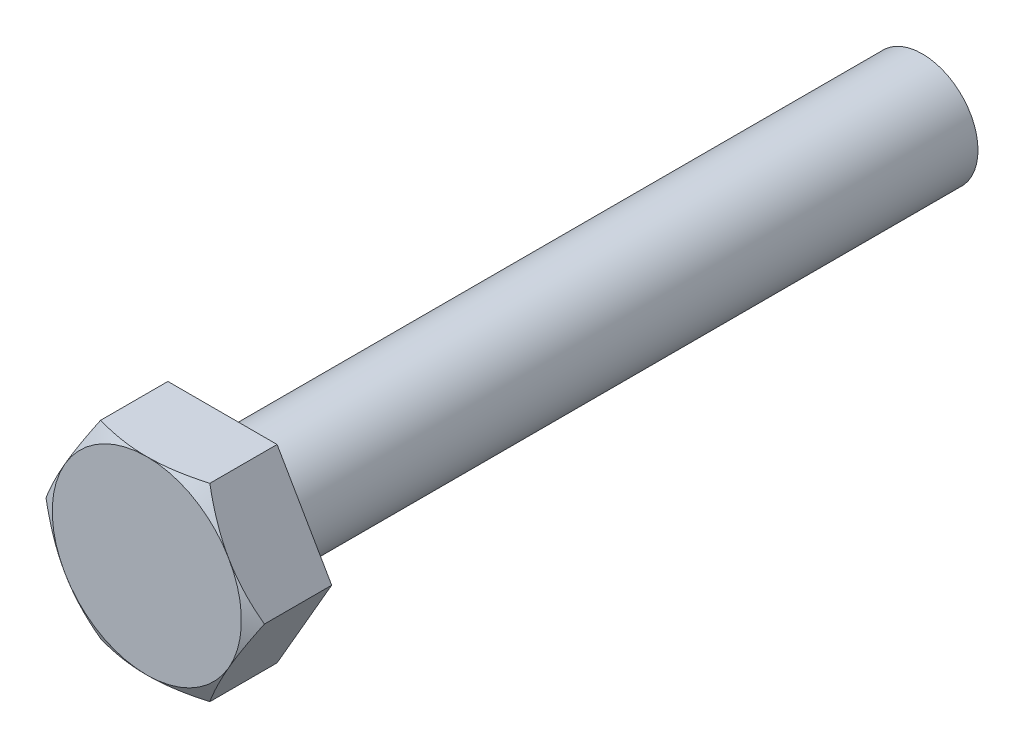
ISO-10303-21;
HEADER;
FILE_DESCRIPTION(('STEP AP214'),'2;1');
FILE_NAME('part.step','',(''),(''),'','','');
FILE_SCHEMA(('AUTOMOTIVE_DESIGN { 1 0 10303 214 1 1 1 1 }'));
ENDSEC;
DATA;
#1=APPLICATION_CONTEXT('core data for automotive mechanical design processes');
#2=APPLICATION_PROTOCOL_DEFINITION('international standard','automotive_design',2000,#1);
#3=PRODUCT_CONTEXT('',#1,'mechanical');
#4=PRODUCT('Part','Part','',(#3));
#5=PRODUCT_RELATED_PRODUCT_CATEGORY('part','',(#4));
#6=PRODUCT_DEFINITION_FORMATION('','',#4);
#7=PRODUCT_DEFINITION_CONTEXT('part definition',#1,'design');
#8=PRODUCT_DEFINITION('design','',#6,#7);
#9=PRODUCT_DEFINITION_SHAPE('','',#8);
#10=(LENGTH_UNIT() NAMED_UNIT(*) SI_UNIT(.MILLI.,.METRE.));
#11=(NAMED_UNIT(*) PLANE_ANGLE_UNIT() SI_UNIT($,.RADIAN.));
#12=(NAMED_UNIT(*) SI_UNIT($,.STERADIAN.) SOLID_ANGLE_UNIT());
#13=UNCERTAINTY_MEASURE_WITH_UNIT(LENGTH_MEASURE(1.E-05),#10,'distance_accuracy_value','');
#14=(GEOMETRIC_REPRESENTATION_CONTEXT(3) GLOBAL_UNCERTAINTY_ASSIGNED_CONTEXT((#13)) GLOBAL_UNIT_ASSIGNED_CONTEXT((#10,
#11,#12)) REPRESENTATION_CONTEXT('',''));
#15=CARTESIAN_POINT('',(0.,0.,0.));
#16=DIRECTION('',(0.,0.,1.));
#17=DIRECTION('',(1.,0.,0.));
#18=AXIS2_PLACEMENT_3D('',#15,#16,#17);
#19=CARTESIAN_POINT('',(30.,0.,0.));
#20=DIRECTION('',(0.,0.,1.));
#21=DIRECTION('',(1.,0.,0.));
#22=AXIS2_PLACEMENT_3D('',#19,#20,#21);
#23=PLANE('',#22);
#24=CARTESIAN_POINT('',(30.,0.,0.));
#25=DIRECTION('',(0.,0.,1.));
#26=DIRECTION('',(1.,0.,0.));
#27=AXIS2_PLACEMENT_3D('',#24,#25,#26);
#28=CIRCLE('',#27,2.942);
#29=CARTESIAN_POINT('',(32.942,0.,0.));
#30=VERTEX_POINT('',#29);
#31=EDGE_CURVE('E396',#30,#30,#28,.T.);
#32=ORIENTED_EDGE('',*,*,#31,.T.);
#33=EDGE_LOOP('',(#32));
#34=FACE_BOUND('',#33,.T.);
#35=DIRECTION('',(-0.5,-0.866025403784439,0.));
#36=VECTOR('',#35,1.);
#37=CARTESIAN_POINT('',(27.1132486540519,5.,0.));
#38=LINE('',#37,#36);
#39=CARTESIAN_POINT('',(27.1132486540519,5.,0.));
#40=VERTEX_POINT('',#39);
#41=CARTESIAN_POINT('',(25.6698729810553,2.49999999996098,0.));
#42=VERTEX_POINT('',#41);
#43=EDGE_CURVE('E13',#40,#42,#38,.T.);
#44=ORIENTED_EDGE('',*,*,#43,.F.);
#45=DIRECTION('',(-1.,0.,0.));
#46=VECTOR('',#45,1.);
#47=CARTESIAN_POINT('',(32.8867513459481,5.,0.));
#48=LINE('',#47,#46);
#49=CARTESIAN_POINT('',(32.8867513459481,5.,0.));
#50=VERTEX_POINT('',#49);
#51=EDGE_CURVE('E159',#50,#40,#48,.T.);
#52=ORIENTED_EDGE('',*,*,#51,.F.);
#53=DIRECTION('',(-0.5,0.866025403784439,0.));
#54=VECTOR('',#53,1.);
#55=CARTESIAN_POINT('',(35.7735026918963,0.,0.));
#56=LINE('',#55,#54);
#57=CARTESIAN_POINT('',(35.7735026918963,0.,0.));
#58=VERTEX_POINT('',#57);
#59=EDGE_CURVE('E259',#58,#50,#56,.T.);
#60=ORIENTED_EDGE('',*,*,#59,.F.);
#61=DIRECTION('',(0.5,0.866025403784439,0.));
#62=VECTOR('',#61,1.);
#63=CARTESIAN_POINT('',(32.8867513459481,-5.,0.));
#64=LINE('',#63,#62);
#65=CARTESIAN_POINT('',(32.8867513459481,-5.,0.));
#66=VERTEX_POINT('',#65);
#67=EDGE_CURVE('E264',#66,#58,#64,.T.);
#68=ORIENTED_EDGE('',*,*,#67,.F.);
#69=DIRECTION('',(1.,0.,0.));
#70=VECTOR('',#69,1.);
#71=CARTESIAN_POINT('',(27.1132486540519,-5.,0.));
#72=LINE('',#71,#70);
#73=CARTESIAN_POINT('',(27.1132486540519,-5.,0.));
#74=VERTEX_POINT('',#73);
#75=EDGE_CURVE('E61',#74,#66,#72,.T.);
#76=ORIENTED_EDGE('',*,*,#75,.F.);
#77=DIRECTION('',(0.5,-0.866025403784439,0.));
#78=VECTOR('',#77,1.);
#79=CARTESIAN_POINT('',(24.2264973081037,0.,0.));
#80=LINE('',#79,#78);
#81=CARTESIAN_POINT('',(24.2264973081037,0.,0.));
#82=VERTEX_POINT('',#81);
#83=EDGE_CURVE('E271',#82,#74,#80,.T.);
#84=ORIENTED_EDGE('',*,*,#83,.F.);
#85=DIRECTION('',(-0.5,-0.866025403784439,0.));
#86=VECTOR('',#85,1.);
#87=CARTESIAN_POINT('',(27.1132486540519,5.,0.));
#88=LINE('',#87,#86);
#89=EDGE_CURVE('E276',#42,#82,#88,.T.);
#90=ORIENTED_EDGE('',*,*,#89,.F.);
#91=EDGE_LOOP('',(#44,#52,#60,#68,#76,#84,#90));
#92=FACE_BOUND('',#91,.T.);
#93=ADVANCED_FACE('F55',(#34,#92),#23,.F.);
#94=CARTESIAN_POINT('',(27.1132486540519,5.,0.));
#95=DIRECTION('',(-0.866025403784439,0.5,0.));
#96=DIRECTION('',(0.,0.,1.));
#97=AXIS2_PLACEMENT_3D('',#94,#95,#96);
#98=PLANE('',#97);
#99=CARTESIAN_POINT('',(25.6699074882496,2.50005976817477,4.));
#100=CARTESIAN_POINT('',(26.3397644545274,3.66028606757194,3.99998940916557));
#101=CARTESIAN_POINT('',(27.1132486540519,5.,3.55699301169242));
#102=(BOUNDED_CURVE() B_SPLINE_CURVE(2,(#99,#100,#101),.UNSPECIFIED.,.F.,
.F.) B_SPLINE_CURVE_WITH_KNOTS((3,3),(0.292796202929762,0.585577874926028),
.UNSPECIFIED.) CURVE() GEOMETRIC_REPRESENTATION_ITEM() RATIONAL_B_SPLINE_CURVE((1.0000018836289,
1.03795390746427,1.)) REPRESENTATION_ITEM(''));
#103=CARTESIAN_POINT('',(25.6698729810553,2.49999999996098,4.));
#104=VERTEX_POINT('',#103);
#105=CARTESIAN_POINT('',(27.1132486540519,5.,3.55699301169242));
#106=VERTEX_POINT('',#105);
#107=EDGE_CURVE('E169',#104,#106,#102,.T.);
#108=ORIENTED_EDGE('',*,*,#107,.T.);
#109=DIRECTION('',(0.,0.,1.));
#110=VECTOR('',#109,1.);
#111=CARTESIAN_POINT('',(27.1132486540519,5.,0.));
#112=LINE('',#111,#110);
#113=EDGE_CURVE('E155',#40,#106,#112,.T.);
#114=ORIENTED_EDGE('',*,*,#113,.F.);
#115=ORIENTED_EDGE('',*,*,#43,.T.);
#116=DIRECTION('',(0.,0.,1.));
#117=VECTOR('',#116,1.);
#118=CARTESIAN_POINT('',(25.6699074882496,2.50005976817477,0.));
#119=LINE('',#118,#117);
#120=EDGE_CURVE('E177',#42,#104,#119,.T.);
#121=ORIENTED_EDGE('',*,*,#120,.T.);
#122=EDGE_LOOP('',(#108,#114,#115,#121));
#123=FACE_BOUND('',#122,.T.);
#124=ADVANCED_FACE('F176',(#123),#98,.T.);
#125=CARTESIAN_POINT('',(27.1132486540519,-5.,0.));
#126=DIRECTION('',(0.,-1.,0.));
#127=DIRECTION('',(-1.,0.,0.));
#128=AXIS2_PLACEMENT_3D('',#125,#126,#127);
#129=PLANE('',#128);
#130=CARTESIAN_POINT('',(30.,-5.,4.));
#131=CARTESIAN_POINT('',(28.6602540378444,-5.,4.));
#132=CARTESIAN_POINT('',(27.1132486540519,-5.,3.55699301169242));
#133=(BOUNDED_CURVE() B_SPLINE_CURVE(2,(#130,#131,#132),.UNSPECIFIED.,.F.,
.F.) B_SPLINE_CURVE_WITH_KNOTS((3,3),(0.292788937463013,0.585577874926026),
.UNSPECIFIED.) CURVE() GEOMETRIC_REPRESENTATION_ITEM() RATIONAL_B_SPLINE_CURVE((1.,
1.0379548493021,1.)) REPRESENTATION_ITEM(''));
#134=CARTESIAN_POINT('',(30.,-5.,4.));
#135=VERTEX_POINT('',#134);
#136=CARTESIAN_POINT('',(27.1132486540519,-5.,3.55699301169242));
#137=VERTEX_POINT('',#136);
#138=EDGE_CURVE('E220',#135,#137,#133,.T.);
#139=ORIENTED_EDGE('',*,*,#138,.T.);
#140=DIRECTION('',(0.,0.,1.));
#141=VECTOR('',#140,1.);
#142=CARTESIAN_POINT('',(27.1132486540519,-5.,0.));
#143=LINE('',#142,#141);
#144=EDGE_CURVE('E274',#74,#137,#143,.T.);
#145=ORIENTED_EDGE('',*,*,#144,.F.);
#146=ORIENTED_EDGE('',*,*,#75,.T.);
#147=DIRECTION('',(0.,0.,1.));
#148=VECTOR('',#147,1.);
#149=CARTESIAN_POINT('',(32.8867513459481,-5.,0.));
#150=LINE('',#149,#148);
#151=CARTESIAN_POINT('',(32.8867513459481,-5.,3.55699301169242));
#152=VERTEX_POINT('',#151);
#153=EDGE_CURVE('E265',#66,#152,#150,.T.);
#154=ORIENTED_EDGE('',*,*,#153,.T.);
#155=CARTESIAN_POINT('',(32.8867513459481,-5.,3.55699301169242));
#156=CARTESIAN_POINT('',(31.3397459621556,-5.,4.));
#157=CARTESIAN_POINT('',(30.,-5.,4.));
#158=(BOUNDED_CURVE() B_SPLINE_CURVE(2,(#155,#156,#157),.UNSPECIFIED.,.F.,
.F.) B_SPLINE_CURVE_WITH_KNOTS((3,3),(0.,0.292788937463013),
.UNSPECIFIED.) CURVE() GEOMETRIC_REPRESENTATION_ITEM() RATIONAL_B_SPLINE_CURVE((1.,
1.03795484930212,1.)) REPRESENTATION_ITEM(''));
#159=EDGE_CURVE('E388',#152,#135,#158,.T.);
#160=ORIENTED_EDGE('',*,*,#159,.T.);
#161=EDGE_LOOP('',(#139,#145,#146,#154,#160));
#162=FACE_BOUND('',#161,.T.);
#163=ADVANCED_FACE('F53',(#162),#129,.T.);
#164=CARTESIAN_POINT('',(30.,0.,4.));
#165=DIRECTION('',(0.,0.,1.));
#166=DIRECTION('',(1.,0.,0.));
#167=AXIS2_PLACEMENT_3D('',#164,#165,#166);
#168=PLANE('',#167);
#169=CARTESIAN_POINT('',(30.,0.,4.));
#170=DIRECTION('',(0.,0.,1.));
#171=DIRECTION('',(-1.,0.,0.));
#172=AXIS2_PLACEMENT_3D('',#169,#170,#171);
#173=CIRCLE('',#172,5.);
#174=CARTESIAN_POINT('',(25.6698729810778,-2.5,4.));
#175=VERTEX_POINT('',#174);
#176=EDGE_CURVE('E198',#104,#175,#173,.T.);
#177=ORIENTED_EDGE('',*,*,#176,.T.);
#178=CARTESIAN_POINT('',(30.,0.,4.));
#179=DIRECTION('',(0.,0.,1.));
#180=DIRECTION('',(-1.,0.,0.));
#181=AXIS2_PLACEMENT_3D('',#178,#179,#180);
#182=CIRCLE('',#181,5.);
#183=EDGE_CURVE('E208',#175,#135,#182,.T.);
#184=ORIENTED_EDGE('',*,*,#183,.T.);
#185=CARTESIAN_POINT('',(30.,0.,4.));
#186=DIRECTION('',(0.,0.,1.));
#187=DIRECTION('',(-1.,0.,0.));
#188=AXIS2_PLACEMENT_3D('',#185,#186,#187);
#189=CIRCLE('',#188,5.);
#190=CARTESIAN_POINT('',(34.3301270189222,-2.5,4.));
#191=VERTEX_POINT('',#190);
#192=EDGE_CURVE('E378',#135,#191,#189,.T.);
#193=ORIENTED_EDGE('',*,*,#192,.T.);
#194=CARTESIAN_POINT('',(30.,0.,4.));
#195=DIRECTION('',(0.,0.,1.));
#196=DIRECTION('',(-1.,0.,0.));
#197=AXIS2_PLACEMENT_3D('',#194,#195,#196);
#198=CIRCLE('',#197,5.);
#199=CARTESIAN_POINT('',(34.3301270189222,2.5,4.));
#200=VERTEX_POINT('',#199);
#201=EDGE_CURVE('E364',#191,#200,#198,.T.);
#202=ORIENTED_EDGE('',*,*,#201,.T.);
#203=CARTESIAN_POINT('',(30.,0.,4.));
#204=DIRECTION('',(0.,0.,1.));
#205=DIRECTION('',(-1.,0.,0.));
#206=AXIS2_PLACEMENT_3D('',#203,#204,#205);
#207=CIRCLE('',#206,5.);
#208=CARTESIAN_POINT('',(30.,5.,4.));
#209=VERTEX_POINT('',#208);
#210=EDGE_CURVE('E190',#200,#209,#207,.T.);
#211=ORIENTED_EDGE('',*,*,#210,.T.);
#212=CARTESIAN_POINT('',(30.,0.,4.));
#213=DIRECTION('',(0.,0.,1.));
#214=DIRECTION('',(-1.,0.,0.));
#215=AXIS2_PLACEMENT_3D('',#212,#213,#214);
#216=CIRCLE('',#215,5.);
#217=EDGE_CURVE('E172',#209,#104,#216,.T.);
#218=ORIENTED_EDGE('',*,*,#217,.T.);
#219=EDGE_LOOP('',(#177,#184,#193,#202,#211,#218));
#220=FACE_BOUND('',#219,.T.);
#221=ADVANCED_FACE('F459',(#220),#168,.T.);
#222=CARTESIAN_POINT('',(25.669838473861,2.49994023174718,0.));
#223=DIRECTION('',(-0.866025403784439,0.5,0.));
#224=DIRECTION('',(0.,0.,1.));
#225=AXIS2_PLACEMENT_3D('',#222,#223,#224);
#226=PLANE('',#225);
#227=CARTESIAN_POINT('',(24.2264973081037,0.,3.55699301169242));
#228=CARTESIAN_POINT('',(24.9999815076003,1.3397139323798,3.99998940915419));
#229=CARTESIAN_POINT('',(25.6698384738609,2.49994023174719,4.));
#230=(BOUNDED_CURVE() B_SPLINE_CURVE(2,(#227,#228,#229),.UNSPECIFIED.,.F.,
.F.) B_SPLINE_CURVE_WITH_KNOTS((3,3),(0.,0.292781671988463),
.UNSPECIFIED.) CURVE() GEOMETRIC_REPRESENTATION_ITEM() RATIONAL_B_SPLINE_CURVE((1.,
1.03795390746319,1.00000188363093)) REPRESENTATION_ITEM(''));
#231=CARTESIAN_POINT('',(24.2264973081037,0.,3.55699301169242));
#232=VERTEX_POINT('',#231);
#233=EDGE_CURVE('E202',#232,#104,#230,.T.);
#234=ORIENTED_EDGE('',*,*,#233,.T.);
#235=ORIENTED_EDGE('',*,*,#120,.F.);
#236=ORIENTED_EDGE('',*,*,#89,.T.);
#237=DIRECTION('',(0.,0.,1.));
#238=VECTOR('',#237,1.);
#239=CARTESIAN_POINT('',(24.2264973081037,0.,0.));
#240=LINE('',#239,#238);
#241=EDGE_CURVE('E268',#82,#232,#240,.T.);
#242=ORIENTED_EDGE('',*,*,#241,.T.);
#243=EDGE_LOOP('',(#234,#235,#236,#242));
#244=FACE_BOUND('',#243,.T.);
#245=ADVANCED_FACE('F467',(#244),#226,.T.);
#246=CARTESIAN_POINT('',(24.2264973081037,0.,0.));
#247=DIRECTION('',(-0.866025403784439,-0.5,0.));
#248=DIRECTION('',(-0.5,0.866025403784439,0.));
#249=AXIS2_PLACEMENT_3D('',#246,#247,#248);
#250=PLANE('',#249);
#251=CARTESIAN_POINT('',(25.6698729810778,-2.5,4.));
#252=CARTESIAN_POINT('',(25.,-1.33974596215561,4.));
#253=CARTESIAN_POINT('',(24.2264973081037,0.,3.55699301169242));
#254=(BOUNDED_CURVE() B_SPLINE_CURVE(2,(#251,#252,#253),.UNSPECIFIED.,.F.,
.F.) B_SPLINE_CURVE_WITH_KNOTS((3,3),(0.292788937463013,0.585577874926026),
.UNSPECIFIED.) CURVE() GEOMETRIC_REPRESENTATION_ITEM() RATIONAL_B_SPLINE_CURVE((1.,
1.03795484930207,1.)) REPRESENTATION_ITEM(''));
#255=EDGE_CURVE('E201',#175,#232,#254,.T.);
#256=ORIENTED_EDGE('',*,*,#255,.T.);
#257=ORIENTED_EDGE('',*,*,#241,.F.);
#258=ORIENTED_EDGE('',*,*,#83,.T.);
#259=ORIENTED_EDGE('',*,*,#144,.T.);
#260=CARTESIAN_POINT('',(27.1132486540519,-5.,3.55699301169242));
#261=CARTESIAN_POINT('',(26.3397459621556,-3.66025403784439,4.));
#262=CARTESIAN_POINT('',(25.6698729810778,-2.5,4.));
#263=(BOUNDED_CURVE() B_SPLINE_CURVE(2,(#260,#261,#262),.UNSPECIFIED.,.F.,
.F.) B_SPLINE_CURVE_WITH_KNOTS((3,3),(0.,0.292788937463013),
.UNSPECIFIED.) CURVE() GEOMETRIC_REPRESENTATION_ITEM() RATIONAL_B_SPLINE_CURVE((1.,
1.03795484930203,1.)) REPRESENTATION_ITEM(''));
#264=EDGE_CURVE('E230',#137,#175,#263,.T.);
#265=ORIENTED_EDGE('',*,*,#264,.T.);
#266=EDGE_LOOP('',(#256,#257,#258,#259,#265));
#267=FACE_BOUND('',#266,.T.);
#268=ADVANCED_FACE('F438',(#267),#250,.T.);
#269=CARTESIAN_POINT('',(32.8867513459481,-5.,0.));
#270=DIRECTION('',(0.866025403784439,-0.5,0.));
#271=DIRECTION('',(0.,0.,-1.));
#272=AXIS2_PLACEMENT_3D('',#269,#270,#271);
#273=PLANE('',#272);
#274=CARTESIAN_POINT('',(35.7735026918963,0.,3.55699301169242));
#275=CARTESIAN_POINT('',(35.,-1.33974596215562,4.));
#276=CARTESIAN_POINT('',(34.3301270189222,-2.5,4.));
#277=(BOUNDED_CURVE() B_SPLINE_CURVE(2,(#274,#275,#276),.UNSPECIFIED.,.F.,
.F.) B_SPLINE_CURVE_WITH_KNOTS((3,3),(0.,0.292788937463012),
.UNSPECIFIED.) CURVE() GEOMETRIC_REPRESENTATION_ITEM() RATIONAL_B_SPLINE_CURVE((1.,
1.03795484930209,1.)) REPRESENTATION_ITEM(''));
#278=CARTESIAN_POINT('',(35.7735026918963,0.,3.55699301169242));
#279=VERTEX_POINT('',#278);
#280=EDGE_CURVE('E363',#279,#191,#277,.T.);
#281=ORIENTED_EDGE('',*,*,#280,.T.);
#282=CARTESIAN_POINT('',(34.3301270189222,-2.5,4.));
#283=CARTESIAN_POINT('',(33.6602540378444,-3.66025403784439,4.));
#284=CARTESIAN_POINT('',(32.8867513459481,-5.,3.55699301169242));
#285=(BOUNDED_CURVE() B_SPLINE_CURVE(2,(#282,#283,#284),.UNSPECIFIED.,.F.,
.F.) B_SPLINE_CURVE_WITH_KNOTS((3,3),(0.292788937463012,0.585577874926025),
.UNSPECIFIED.) CURVE() GEOMETRIC_REPRESENTATION_ITEM() RATIONAL_B_SPLINE_CURVE((1.,
1.03795484930202,1.)) REPRESENTATION_ITEM(''));
#286=EDGE_CURVE('E383',#191,#152,#285,.T.);
#287=ORIENTED_EDGE('',*,*,#286,.T.);
#288=ORIENTED_EDGE('',*,*,#153,.F.);
#289=ORIENTED_EDGE('',*,*,#67,.T.);
#290=DIRECTION('',(0.,0.,1.));
#291=VECTOR('',#290,1.);
#292=CARTESIAN_POINT('',(35.7735026918963,0.,0.));
#293=LINE('',#292,#291);
#294=EDGE_CURVE('E162',#58,#279,#293,.T.);
#295=ORIENTED_EDGE('',*,*,#294,.T.);
#296=EDGE_LOOP('',(#281,#287,#288,#289,#295));
#297=FACE_BOUND('',#296,.T.);
#298=ADVANCED_FACE('F455',(#297),#273,.T.);
#299=CARTESIAN_POINT('',(35.7735026918963,0.,0.));
#300=DIRECTION('',(0.866025403784439,0.5,0.));
#301=DIRECTION('',(0.,0.,-1.));
#302=AXIS2_PLACEMENT_3D('',#299,#300,#301);
#303=PLANE('',#302);
#304=CARTESIAN_POINT('',(32.8867513459481,5.,3.55699301169242));
#305=CARTESIAN_POINT('',(33.6602540378444,3.66025403784438,4.));
#306=CARTESIAN_POINT('',(34.3301270189222,2.5,4.));
#307=(BOUNDED_CURVE() B_SPLINE_CURVE(2,(#304,#305,#306),.UNSPECIFIED.,.F.,
.F.) B_SPLINE_CURVE_WITH_KNOTS((3,3),(0.,0.292788937463014),
.UNSPECIFIED.) CURVE() GEOMETRIC_REPRESENTATION_ITEM() RATIONAL_B_SPLINE_CURVE((1.,
1.03795484930203,1.)) REPRESENTATION_ITEM(''));
#308=CARTESIAN_POINT('',(32.8867513459481,5.,3.55699301169242));
#309=VERTEX_POINT('',#308);
#310=EDGE_CURVE('E179',#309,#200,#307,.T.);
#311=ORIENTED_EDGE('',*,*,#310,.T.);
#312=CARTESIAN_POINT('',(34.3301270189222,2.5,4.));
#313=CARTESIAN_POINT('',(35.,1.33974596215562,4.));
#314=CARTESIAN_POINT('',(35.7735026918963,0.,3.55699301169242));
#315=(BOUNDED_CURVE() B_SPLINE_CURVE(2,(#312,#313,#314),.UNSPECIFIED.,.F.,
.F.) B_SPLINE_CURVE_WITH_KNOTS((3,3),(0.292788937463014,0.585577874926027),
.UNSPECIFIED.) CURVE() GEOMETRIC_REPRESENTATION_ITEM() RATIONAL_B_SPLINE_CURVE((1.,
1.03795484930205,1.)) REPRESENTATION_ITEM(''));
#316=EDGE_CURVE('E371',#200,#279,#315,.T.);
#317=ORIENTED_EDGE('',*,*,#316,.T.);
#318=ORIENTED_EDGE('',*,*,#294,.F.);
#319=ORIENTED_EDGE('',*,*,#59,.T.);
#320=DIRECTION('',(0.,0.,1.));
#321=VECTOR('',#320,1.);
#322=CARTESIAN_POINT('',(32.8867513459481,5.,0.));
#323=LINE('',#322,#321);
#324=EDGE_CURVE('E171',#50,#309,#323,.T.);
#325=ORIENTED_EDGE('',*,*,#324,.T.);
#326=EDGE_LOOP('',(#311,#317,#318,#319,#325));
#327=FACE_BOUND('',#326,.T.);
#328=ADVANCED_FACE('F466',(#327),#303,.T.);
#329=CARTESIAN_POINT('',(32.8867513459481,5.,0.));
#330=DIRECTION('',(0.,1.,0.));
#331=DIRECTION('',(1.,0.,0.));
#332=AXIS2_PLACEMENT_3D('',#329,#330,#331);
#333=PLANE('',#332);
#334=CARTESIAN_POINT('',(27.1132486540519,5.,3.55699301169242));
#335=CARTESIAN_POINT('',(28.6602540378444,5.,4.));
#336=CARTESIAN_POINT('',(30.,5.,4.));
#337=(BOUNDED_CURVE() B_SPLINE_CURVE(2,(#334,#335,#336),.UNSPECIFIED.,.F.,
.F.) B_SPLINE_CURVE_WITH_KNOTS((3,3),(0.,0.292788937463014),
.UNSPECIFIED.) CURVE() GEOMETRIC_REPRESENTATION_ITEM() RATIONAL_B_SPLINE_CURVE((1.,
1.03795484930204,1.)) REPRESENTATION_ITEM(''));
#338=EDGE_CURVE('E156',#106,#209,#337,.T.);
#339=ORIENTED_EDGE('',*,*,#338,.T.);
#340=CARTESIAN_POINT('',(30.,5.,4.));
#341=CARTESIAN_POINT('',(31.3397459621556,5.,4.));
#342=CARTESIAN_POINT('',(32.8867513459481,5.,3.55699301169242));
#343=(BOUNDED_CURVE() B_SPLINE_CURVE(2,(#340,#341,#342),.UNSPECIFIED.,.F.,
.F.) B_SPLINE_CURVE_WITH_KNOTS((3,3),(0.292788937463014,0.585577874926029),
.UNSPECIFIED.) CURVE() GEOMETRIC_REPRESENTATION_ITEM() RATIONAL_B_SPLINE_CURVE((1.,
1.03795484930205,1.)) REPRESENTATION_ITEM(''));
#344=EDGE_CURVE('E205',#209,#309,#343,.T.);
#345=ORIENTED_EDGE('',*,*,#344,.T.);
#346=ORIENTED_EDGE('',*,*,#324,.F.);
#347=ORIENTED_EDGE('',*,*,#51,.T.);
#348=ORIENTED_EDGE('',*,*,#113,.T.);
#349=EDGE_LOOP('',(#339,#345,#346,#347,#348));
#350=FACE_BOUND('',#349,.T.);
#351=ADVANCED_FACE('F152',(#350),#333,.T.);
#352=CARTESIAN_POINT('',(30.,0.,3.77849650584621));
#353=DIRECTION('',(0.,0.,-1.));
#354=DIRECTION('',(-1.,0.,0.));
#355=AXIS2_PLACEMENT_3D('',#352,#353,#354);
#356=CONICAL_SURFACE('',#355,5.38675134594813,1.05067086203175);
#357=ORIENTED_EDGE('',*,*,#107,.F.);
#358=ORIENTED_EDGE('',*,*,#217,.F.);
#359=ORIENTED_EDGE('',*,*,#338,.F.);
#360=EDGE_LOOP('',(#357,#358,#359));
#361=FACE_BOUND('',#360,.T.);
#362=ADVANCED_FACE('F170',(#361),#356,.T.);
#363=CARTESIAN_POINT('',(30.,0.,3.77849650584621));
#364=DIRECTION('',(0.,0.,-1.));
#365=DIRECTION('',(-1.,0.,0.));
#366=AXIS2_PLACEMENT_3D('',#363,#364,#365);
#367=CONICAL_SURFACE('',#366,5.38675134594813,1.05067086203175);
#368=ORIENTED_EDGE('',*,*,#344,.F.);
#369=ORIENTED_EDGE('',*,*,#210,.F.);
#370=ORIENTED_EDGE('',*,*,#310,.F.);
#371=EDGE_LOOP('',(#368,#369,#370));
#372=FACE_BOUND('',#371,.T.);
#373=ADVANCED_FACE('F461',(#372),#367,.T.);
#374=CARTESIAN_POINT('',(30.,0.,3.77849650584621));
#375=DIRECTION('',(0.,0.,-1.));
#376=DIRECTION('',(-1.,0.,0.));
#377=AXIS2_PLACEMENT_3D('',#374,#375,#376);
#378=CONICAL_SURFACE('',#377,5.38675134594813,1.05067086203175);
#379=ORIENTED_EDGE('',*,*,#233,.F.);
#380=ORIENTED_EDGE('',*,*,#255,.F.);
#381=ORIENTED_EDGE('',*,*,#176,.F.);
#382=EDGE_LOOP('',(#379,#380,#381));
#383=FACE_BOUND('',#382,.T.);
#384=ADVANCED_FACE('F491',(#383),#378,.T.);
#385=CARTESIAN_POINT('',(30.,0.,3.77849650584621));
#386=DIRECTION('',(0.,0.,-1.));
#387=DIRECTION('',(-1.,0.,0.));
#388=AXIS2_PLACEMENT_3D('',#385,#386,#387);
#389=CONICAL_SURFACE('',#388,5.38675134594813,1.05067086203175);
#390=ORIENTED_EDGE('',*,*,#264,.F.);
#391=ORIENTED_EDGE('',*,*,#138,.F.);
#392=ORIENTED_EDGE('',*,*,#183,.F.);
#393=EDGE_LOOP('',(#390,#391,#392));
#394=FACE_BOUND('',#393,.T.);
#395=ADVANCED_FACE('F444',(#394),#389,.T.);
#396=CARTESIAN_POINT('',(30.,0.,3.77849650584621));
#397=DIRECTION('',(0.,0.,-1.));
#398=DIRECTION('',(1.,0.,0.));
#399=AXIS2_PLACEMENT_3D('',#396,#397,#398);
#400=CONICAL_SURFACE('',#399,5.38675134594813,1.05067086203175);
#401=ORIENTED_EDGE('',*,*,#316,.F.);
#402=ORIENTED_EDGE('',*,*,#201,.F.);
#403=ORIENTED_EDGE('',*,*,#280,.F.);
#404=EDGE_LOOP('',(#401,#402,#403));
#405=FACE_BOUND('',#404,.T.);
#406=ADVANCED_FACE('F456',(#405),#400,.T.);
#407=CARTESIAN_POINT('',(30.,0.,3.77849650584621));
#408=DIRECTION('',(0.,0.,-1.));
#409=DIRECTION('',(-1.,0.,0.));
#410=AXIS2_PLACEMENT_3D('',#407,#408,#409);
#411=CONICAL_SURFACE('',#410,5.38675134594813,1.05067086203175);
#412=ORIENTED_EDGE('',*,*,#159,.F.);
#413=ORIENTED_EDGE('',*,*,#286,.F.);
#414=ORIENTED_EDGE('',*,*,#192,.F.);
#415=EDGE_LOOP('',(#412,#413,#414));
#416=FACE_BOUND('',#415,.T.);
#417=ADVANCED_FACE('F446',(#416),#411,.T.);
#418=CARTESIAN_POINT('',(30.,0.,0.));
#419=DIRECTION('',(0.,0.,-1.));
#420=DIRECTION('',(1.,0.,0.));
#421=AXIS2_PLACEMENT_3D('',#418,#419,#420);
#422=CYLINDRICAL_SURFACE('',#421,2.942);
#423=ORIENTED_EDGE('',*,*,#31,.F.);
#424=EDGE_LOOP('',(#423));
#425=FACE_BOUND('',#424,.T.);
#426=CARTESIAN_POINT('',(30.,0.,-37.));
#427=DIRECTION('',(0.,0.,-1.));
#428=DIRECTION('',(-1.,0.,0.));
#429=AXIS2_PLACEMENT_3D('',#426,#427,#428);
#430=CIRCLE('',#429,2.942);
#431=CARTESIAN_POINT('',(27.058,0.,-37.));
#432=VERTEX_POINT('',#431);
#433=EDGE_CURVE('E405',#432,#432,#430,.T.);
#434=ORIENTED_EDGE('',*,*,#433,.F.);
#435=EDGE_LOOP('',(#434));
#436=FACE_BOUND('',#435,.T.);
#437=ADVANCED_FACE('F515',(#425,#436),#422,.T.);
#438=CARTESIAN_POINT('',(30.,0.,-37.));
#439=DIRECTION('',(0.,0.,-1.));
#440=DIRECTION('',(-1.,0.,0.));
#441=AXIS2_PLACEMENT_3D('',#438,#439,#440);
#442=PLANE('',#441);
#443=ORIENTED_EDGE('',*,*,#433,.T.);
#444=EDGE_LOOP('',(#443));
#445=FACE_BOUND('',#444,.T.);
#446=ADVANCED_FACE('F520',(#445),#442,.T.);
#447=CLOSED_SHELL('',(#93,#124,#163,#221,#245,#268,#298,#328,#351,#362,#373,#384,#395,#406,#417,
#437,#446));
#448=MANIFOLD_SOLID_BREP('B2',#447);
#449=ADVANCED_BREP_SHAPE_REPRESENTATION('',(#18,#448),#14);
#450=SHAPE_DEFINITION_REPRESENTATION(#9,#449);
ENDSEC;
END-ISO-10303-21;
